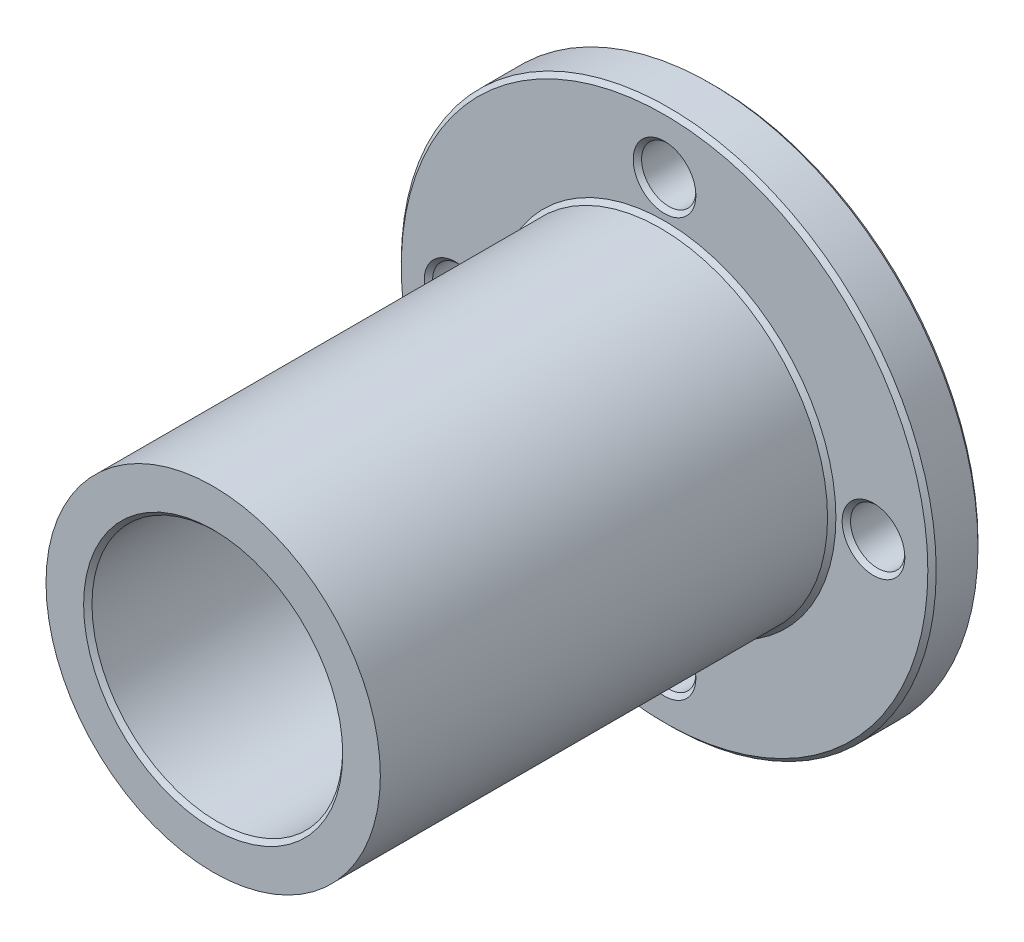
ISO-10303-21;
HEADER;
FILE_DESCRIPTION(('STEP AP214'),'2;1');
FILE_NAME('part.step','',(''),(''),'','','');
FILE_SCHEMA(('AUTOMOTIVE_DESIGN { 1 0 10303 214 1 1 1 1 }'));
ENDSEC;
DATA;
#1=APPLICATION_CONTEXT('core data for automotive mechanical design processes');
#2=APPLICATION_PROTOCOL_DEFINITION('international standard','automotive_design',2000,#1);
#3=PRODUCT_CONTEXT('',#1,'mechanical');
#4=PRODUCT('Part','Part','',(#3));
#5=PRODUCT_RELATED_PRODUCT_CATEGORY('part','',(#4));
#6=PRODUCT_DEFINITION_FORMATION('','',#4);
#7=PRODUCT_DEFINITION_CONTEXT('part definition',#1,'design');
#8=PRODUCT_DEFINITION('design','',#6,#7);
#9=PRODUCT_DEFINITION_SHAPE('','',#8);
#10=(LENGTH_UNIT() NAMED_UNIT(*) SI_UNIT(.MILLI.,.METRE.));
#11=(NAMED_UNIT(*) PLANE_ANGLE_UNIT() SI_UNIT($,.RADIAN.));
#12=(NAMED_UNIT(*) SI_UNIT($,.STERADIAN.) SOLID_ANGLE_UNIT());
#13=UNCERTAINTY_MEASURE_WITH_UNIT(LENGTH_MEASURE(1.E-05),#10,'distance_accuracy_value','');
#14=(GEOMETRIC_REPRESENTATION_CONTEXT(3) GLOBAL_UNCERTAINTY_ASSIGNED_CONTEXT((#13)) GLOBAL_UNIT_ASSIGNED_CONTEXT((#10,
#11,#12)) REPRESENTATION_CONTEXT('',''));
#15=CARTESIAN_POINT('',(0.,0.,0.));
#16=DIRECTION('',(0.,0.,1.));
#17=DIRECTION('',(1.,0.,0.));
#18=AXIS2_PLACEMENT_3D('',#15,#16,#17);
#19=CARTESIAN_POINT('',(0.,0.,6.));
#20=DIRECTION('',(0.,0.,1.));
#21=DIRECTION('',(1.,0.,0.));
#22=AXIS2_PLACEMENT_3D('',#19,#20,#21);
#23=PLANE('',#22);
#24=CARTESIAN_POINT('',(0.,0.,6.));
#25=DIRECTION('',(0.,0.,1.));
#26=DIRECTION('',(1.,0.,0.));
#27=AXIS2_PLACEMENT_3D('',#24,#25,#26);
#28=CIRCLE('',#27,20.5);
#29=CARTESIAN_POINT('',(20.5,0.,6.));
#30=VERTEX_POINT('',#29);
#31=EDGE_CURVE('E53',#30,#30,#28,.F.);
#32=ORIENTED_EDGE('',*,*,#31,.T.);
#33=EDGE_LOOP('',(#32));
#34=FACE_BOUND('',#33,.T.);
#35=CARTESIAN_POINT('',(0.,0.,6.));
#36=DIRECTION('',(0.,0.,1.));
#37=DIRECTION('',(1.,0.,0.));
#38=AXIS2_PLACEMENT_3D('',#35,#36,#37);
#39=CIRCLE('',#38,31.5);
#40=CARTESIAN_POINT('',(31.5,0.,6.));
#41=VERTEX_POINT('',#40);
#42=EDGE_CURVE('E58',#41,#41,#39,.T.);
#43=ORIENTED_EDGE('',*,*,#42,.T.);
#44=EDGE_LOOP('',(#43));
#45=FACE_BOUND('',#44,.T.);
#46=CARTESIAN_POINT('',(24.9999999999993,-7.09011927261166E-13,6.));
#47=DIRECTION('',(0.,0.,1.));
#48=DIRECTION('',(1.,0.,0.));
#49=AXIS2_PLACEMENT_3D('',#46,#47,#48);
#50=CIRCLE('',#49,3.75000000000114);
#51=CARTESIAN_POINT('',(28.7500000000004,-7.09011927261166E-13,6.));
#52=VERTEX_POINT('',#51);
#53=EDGE_CURVE('E64',#52,#52,#50,.F.);
#54=ORIENTED_EDGE('',*,*,#53,.T.);
#55=EDGE_LOOP('',(#54));
#56=FACE_BOUND('',#55,.T.);
#57=CARTESIAN_POINT('',(-1.4119006205266E-12,-25.,6.));
#58=DIRECTION('',(0.,0.,1.));
#59=DIRECTION('',(1.,0.,0.));
#60=AXIS2_PLACEMENT_3D('',#57,#58,#59);
#61=CIRCLE('',#60,3.75000000000153);
#62=CARTESIAN_POINT('',(3.75000000000012,-25.,6.));
#63=VERTEX_POINT('',#62);
#64=EDGE_CURVE('E68',#63,#63,#61,.F.);
#65=ORIENTED_EDGE('',*,*,#64,.T.);
#66=EDGE_LOOP('',(#65));
#67=FACE_BOUND('',#66,.T.);
#68=CARTESIAN_POINT('',(-25.0000000000007,7.05950310263298E-13,6.));
#69=DIRECTION('',(0.,0.,1.));
#70=DIRECTION('',(1.,0.,0.));
#71=AXIS2_PLACEMENT_3D('',#68,#69,#70);
#72=CIRCLE('',#71,3.75000000000055);
#73=CARTESIAN_POINT('',(-21.2500000000002,7.05950310263298E-13,6.));
#74=VERTEX_POINT('',#73);
#75=EDGE_CURVE('E72',#74,#74,#72,.F.);
#76=ORIENTED_EDGE('',*,*,#75,.T.);
#77=EDGE_LOOP('',(#76));
#78=FACE_BOUND('',#77,.T.);
#79=CARTESIAN_POINT('',(0.,25.,6.));
#80=DIRECTION('',(0.,0.,1.));
#81=DIRECTION('',(1.,0.,0.));
#82=AXIS2_PLACEMENT_3D('',#79,#80,#81);
#83=CIRCLE('',#82,3.75);
#84=CARTESIAN_POINT('',(3.75,25.,6.));
#85=VERTEX_POINT('',#84);
#86=EDGE_CURVE('E76',#85,#85,#83,.F.);
#87=ORIENTED_EDGE('',*,*,#86,.T.);
#88=EDGE_LOOP('',(#87));
#89=FACE_BOUND('',#88,.T.);
#90=ADVANCED_FACE('F39',(#34,#45,#56,#67,#78,#89),#23,.T.);
#91=CARTESIAN_POINT('',(0.,0.,0.));
#92=DIRECTION('',(0.,0.,1.));
#93=DIRECTION('',(1.,0.,0.));
#94=AXIS2_PLACEMENT_3D('',#91,#92,#93);
#95=PLANE('',#94);
#96=CARTESIAN_POINT('',(0.,0.,0.));
#97=DIRECTION('',(0.,0.,1.));
#98=DIRECTION('',(1.,0.,0.));
#99=AXIS2_PLACEMENT_3D('',#96,#97,#98);
#100=CIRCLE('',#99,31.5);
#101=CARTESIAN_POINT('',(31.5,0.,0.));
#102=VERTEX_POINT('',#101);
#103=EDGE_CURVE('E120',#102,#102,#100,.F.);
#104=ORIENTED_EDGE('',*,*,#103,.T.);
#105=EDGE_LOOP('',(#104));
#106=FACE_BOUND('',#105,.T.);
#107=CARTESIAN_POINT('',(0.,0.,0.));
#108=DIRECTION('',(0.,0.,1.));
#109=DIRECTION('',(1.,0.,0.));
#110=AXIS2_PLACEMENT_3D('',#107,#108,#109);
#111=CIRCLE('',#110,20.5);
#112=CARTESIAN_POINT('',(20.5,0.,0.));
#113=VERTEX_POINT('',#112);
#114=EDGE_CURVE('E124',#113,#113,#111,.T.);
#115=ORIENTED_EDGE('',*,*,#114,.T.);
#116=EDGE_LOOP('',(#115));
#117=FACE_BOUND('',#116,.T.);
#118=CARTESIAN_POINT('',(24.9999999999993,-7.09011927261166E-13,0.));
#119=DIRECTION('',(0.,0.,1.));
#120=DIRECTION('',(1.,0.,0.));
#121=AXIS2_PLACEMENT_3D('',#118,#119,#120);
#122=CIRCLE('',#121,3.75000000000114);
#123=CARTESIAN_POINT('',(28.7500000000004,-7.09011927261166E-13,0.));
#124=VERTEX_POINT('',#123);
#125=EDGE_CURVE('E128',#124,#124,#122,.T.);
#126=ORIENTED_EDGE('',*,*,#125,.T.);
#127=EDGE_LOOP('',(#126));
#128=FACE_BOUND('',#127,.T.);
#129=CARTESIAN_POINT('',(-1.4119006205266E-12,-25.,0.));
#130=DIRECTION('',(0.,0.,1.));
#131=DIRECTION('',(1.,0.,0.));
#132=AXIS2_PLACEMENT_3D('',#129,#130,#131);
#133=CIRCLE('',#132,3.75000000000153);
#134=CARTESIAN_POINT('',(3.75000000000012,-25.,0.));
#135=VERTEX_POINT('',#134);
#136=EDGE_CURVE('E132',#135,#135,#133,.T.);
#137=ORIENTED_EDGE('',*,*,#136,.T.);
#138=EDGE_LOOP('',(#137));
#139=FACE_BOUND('',#138,.T.);
#140=CARTESIAN_POINT('',(-25.0000000000007,7.05950310263298E-13,0.));
#141=DIRECTION('',(0.,0.,1.));
#142=DIRECTION('',(1.,0.,0.));
#143=AXIS2_PLACEMENT_3D('',#140,#141,#142);
#144=CIRCLE('',#143,3.75000000000056);
#145=CARTESIAN_POINT('',(-21.2500000000001,7.05950310263298E-13,0.));
#146=VERTEX_POINT('',#145);
#147=EDGE_CURVE('E136',#146,#146,#144,.T.);
#148=ORIENTED_EDGE('',*,*,#147,.T.);
#149=EDGE_LOOP('',(#148));
#150=FACE_BOUND('',#149,.T.);
#151=CARTESIAN_POINT('',(0.,25.,0.));
#152=DIRECTION('',(0.,0.,1.));
#153=DIRECTION('',(1.,0.,0.));
#154=AXIS2_PLACEMENT_3D('',#151,#152,#153);
#155=CIRCLE('',#154,3.75);
#156=CARTESIAN_POINT('',(3.75,25.,0.));
#157=VERTEX_POINT('',#156);
#158=EDGE_CURVE('E140',#157,#157,#155,.T.);
#159=ORIENTED_EDGE('',*,*,#158,.T.);
#160=EDGE_LOOP('',(#159));
#161=FACE_BOUND('',#160,.T.);
#162=ADVANCED_FACE('F183',(#106,#117,#128,#139,#150,#161),#95,.F.);
#163=CARTESIAN_POINT('',(0.,0.,6.));
#164=DIRECTION('',(0.,0.,-1.));
#165=DIRECTION('',(-1.,0.,0.));
#166=AXIS2_PLACEMENT_3D('',#163,#164,#165);
#167=CYLINDRICAL_SURFACE('',#166,32.);
#168=CARTESIAN_POINT('',(0.,0.,0.499999999999994));
#169=DIRECTION('',(0.,0.,1.));
#170=DIRECTION('',(1.,0.,0.));
#171=AXIS2_PLACEMENT_3D('',#168,#169,#170);
#172=CIRCLE('',#171,32.);
#173=CARTESIAN_POINT('',(32.,0.,0.499999999999994));
#174=VERTEX_POINT('',#173);
#175=EDGE_CURVE('E144',#174,#174,#172,.T.);
#176=ORIENTED_EDGE('',*,*,#175,.T.);
#177=EDGE_LOOP('',(#176));
#178=FACE_BOUND('',#177,.T.);
#179=CARTESIAN_POINT('',(0.,0.,5.50000000000001));
#180=DIRECTION('',(0.,0.,1.));
#181=DIRECTION('',(1.,0.,0.));
#182=AXIS2_PLACEMENT_3D('',#179,#180,#181);
#183=CIRCLE('',#182,32.);
#184=CARTESIAN_POINT('',(32.,0.,5.50000000000001));
#185=VERTEX_POINT('',#184);
#186=EDGE_CURVE('E148',#185,#185,#183,.F.);
#187=ORIENTED_EDGE('',*,*,#186,.T.);
#188=EDGE_LOOP('',(#187));
#189=FACE_BOUND('',#188,.T.);
#190=ADVANCED_FACE('F189',(#178,#189),#167,.T.);
#191=CARTESIAN_POINT('',(0.,0.,60.));
#192=DIRECTION('',(0.,0.,-1.));
#193=DIRECTION('',(-1.,0.,0.));
#194=AXIS2_PLACEMENT_3D('',#191,#192,#193);
#195=CYLINDRICAL_SURFACE('',#194,20.);
#196=CARTESIAN_POINT('',(0.,0.,6.50000000000001));
#197=DIRECTION('',(0.,0.,1.));
#198=DIRECTION('',(1.,0.,0.));
#199=AXIS2_PLACEMENT_3D('',#196,#197,#198);
#200=CIRCLE('',#199,20.);
#201=CARTESIAN_POINT('',(20.,0.,6.50000000000001));
#202=VERTEX_POINT('',#201);
#203=EDGE_CURVE('E80',#202,#202,#200,.T.);
#204=ORIENTED_EDGE('',*,*,#203,.T.);
#205=EDGE_LOOP('',(#204));
#206=FACE_BOUND('',#205,.T.);
#207=CARTESIAN_POINT('',(0.,0.,60.));
#208=DIRECTION('',(0.,0.,1.));
#209=DIRECTION('',(1.,0.,0.));
#210=AXIS2_PLACEMENT_3D('',#207,#208,#209);
#211=CIRCLE('',#210,20.);
#212=CARTESIAN_POINT('',(20.,0.,60.));
#213=VERTEX_POINT('',#212);
#214=EDGE_CURVE('E152',#213,#213,#211,.T.);
#215=ORIENTED_EDGE('',*,*,#214,.F.);
#216=EDGE_LOOP('',(#215));
#217=FACE_BOUND('',#216,.T.);
#218=ADVANCED_FACE('F194',(#206,#217),#195,.T.);
#219=CARTESIAN_POINT('',(0.,0.,60.));
#220=DIRECTION('',(0.,0.,1.));
#221=DIRECTION('',(1.,0.,0.));
#222=AXIS2_PLACEMENT_3D('',#219,#220,#221);
#223=PLANE('',#222);
#224=CARTESIAN_POINT('',(0.,0.,60.));
#225=DIRECTION('',(0.,0.,1.));
#226=DIRECTION('',(1.,0.,0.));
#227=AXIS2_PLACEMENT_3D('',#224,#225,#226);
#228=CIRCLE('',#227,15.5);
#229=CARTESIAN_POINT('',(15.5,0.,60.));
#230=VERTEX_POINT('',#229);
#231=EDGE_CURVE('E48',#230,#230,#228,.F.);
#232=ORIENTED_EDGE('',*,*,#231,.T.);
#233=EDGE_LOOP('',(#232));
#234=FACE_BOUND('',#233,.T.);
#235=ORIENTED_EDGE('',*,*,#214,.T.);
#236=EDGE_LOOP('',(#235));
#237=FACE_BOUND('',#236,.T.);
#238=ADVANCED_FACE('F427',(#234,#237),#223,.T.);
#239=CARTESIAN_POINT('',(0.,0.,0.));
#240=DIRECTION('',(0.,0.,-1.));
#241=DIRECTION('',(-1.,0.,0.));
#242=AXIS2_PLACEMENT_3D('',#239,#240,#241);
#243=CYLINDRICAL_SURFACE('',#242,15.);
#244=CARTESIAN_POINT('',(0.,0.,59.5));
#245=DIRECTION('',(0.,0.,1.));
#246=DIRECTION('',(1.,0.,0.));
#247=AXIS2_PLACEMENT_3D('',#244,#245,#246);
#248=CIRCLE('',#247,15.);
#249=CARTESIAN_POINT('',(15.,0.,59.5));
#250=VERTEX_POINT('',#249);
#251=EDGE_CURVE('E10',#250,#250,#248,.T.);
#252=ORIENTED_EDGE('',*,*,#251,.T.);
#253=EDGE_LOOP('',(#252));
#254=FACE_BOUND('',#253,.T.);
#255=CARTESIAN_POINT('',(0.,0.,2.3));
#256=DIRECTION('',(0.,0.,-1.));
#257=DIRECTION('',(-1.,0.,0.));
#258=AXIS2_PLACEMENT_3D('',#255,#256,#257);
#259=CIRCLE('',#258,15.);
#260=CARTESIAN_POINT('',(-15.,0.,2.3));
#261=VERTEX_POINT('',#260);
#262=EDGE_CURVE('E156',#261,#261,#259,.T.);
#263=ORIENTED_EDGE('',*,*,#262,.T.);
#264=EDGE_LOOP('',(#263));
#265=FACE_BOUND('',#264,.T.);
#266=ADVANCED_FACE('F179',(#254,#265),#243,.F.);
#267=CARTESIAN_POINT('',(15.,0.,2.3));
#268=DIRECTION('',(0.,0.,1.));
#269=DIRECTION('',(1.,0.,0.));
#270=AXIS2_PLACEMENT_3D('',#267,#268,#269);
#271=PLANE('',#270);
#272=ORIENTED_EDGE('',*,*,#262,.F.);
#273=EDGE_LOOP('',(#272));
#274=FACE_BOUND('',#273,.T.);
#275=CARTESIAN_POINT('',(0.,0.,2.3));
#276=DIRECTION('',(0.,0.,-1.));
#277=DIRECTION('',(-1.,0.,0.));
#278=AXIS2_PLACEMENT_3D('',#275,#276,#277);
#279=CIRCLE('',#278,20.);
#280=CARTESIAN_POINT('',(-20.,0.,2.3));
#281=VERTEX_POINT('',#280);
#282=EDGE_CURVE('E160',#281,#281,#279,.T.);
#283=ORIENTED_EDGE('',*,*,#282,.T.);
#284=EDGE_LOOP('',(#283));
#285=FACE_BOUND('',#284,.T.);
#286=ADVANCED_FACE('F165',(#274,#285),#271,.F.);
#287=CARTESIAN_POINT('',(0.,0.,0.));
#288=DIRECTION('',(0.,0.,-1.));
#289=DIRECTION('',(-1.,0.,0.));
#290=AXIS2_PLACEMENT_3D('',#287,#288,#289);
#291=CYLINDRICAL_SURFACE('',#290,20.);
#292=CARTESIAN_POINT('',(0.,0.,0.499999999999983));
#293=DIRECTION('',(0.,0.,1.));
#294=DIRECTION('',(1.,0.,0.));
#295=AXIS2_PLACEMENT_3D('',#292,#293,#294);
#296=CIRCLE('',#295,20.);
#297=CARTESIAN_POINT('',(20.,0.,0.499999999999983));
#298=VERTEX_POINT('',#297);
#299=EDGE_CURVE('E116',#298,#298,#296,.F.);
#300=ORIENTED_EDGE('',*,*,#299,.T.);
#301=EDGE_LOOP('',(#300));
#302=FACE_BOUND('',#301,.T.);
#303=ORIENTED_EDGE('',*,*,#282,.F.);
#304=EDGE_LOOP('',(#303));
#305=FACE_BOUND('',#304,.T.);
#306=ADVANCED_FACE('F167',(#302,#305),#291,.F.);
#307=CARTESIAN_POINT('',(24.9999999999993,-7.09011927261166E-13,6.));
#308=DIRECTION('',(0.,0.,-1.));
#309=DIRECTION('',(-1.,0.,0.));
#310=AXIS2_PLACEMENT_3D('',#307,#308,#309);
#311=CYLINDRICAL_SURFACE('',#310,3.25000000000113);
#312=CARTESIAN_POINT('',(24.9999999999993,-7.09011927261166E-13,0.500000000000006));
#313=DIRECTION('',(0.,0.,1.));
#314=DIRECTION('',(1.,0.,0.));
#315=AXIS2_PLACEMENT_3D('',#312,#313,#314);
#316=CIRCLE('',#315,3.25000000000113);
#317=CARTESIAN_POINT('',(28.2500000000004,-7.09011927261166E-13,0.500000000000006));
#318=VERTEX_POINT('',#317);
#319=EDGE_CURVE('E108',#318,#318,#316,.F.);
#320=ORIENTED_EDGE('',*,*,#319,.T.);
#321=EDGE_LOOP('',(#320));
#322=FACE_BOUND('',#321,.T.);
#323=CARTESIAN_POINT('',(24.9999999999993,-7.09011927261166E-13,5.5));
#324=DIRECTION('',(0.,0.,1.));
#325=DIRECTION('',(1.,0.,0.));
#326=AXIS2_PLACEMENT_3D('',#323,#324,#325);
#327=CIRCLE('',#326,3.25000000000113);
#328=CARTESIAN_POINT('',(28.2500000000004,-7.09011927261166E-13,5.5));
#329=VERTEX_POINT('',#328);
#330=EDGE_CURVE('E112',#329,#329,#327,.T.);
#331=ORIENTED_EDGE('',*,*,#330,.T.);
#332=EDGE_LOOP('',(#331));
#333=FACE_BOUND('',#332,.T.);
#334=ADVANCED_FACE('F169',(#322,#333),#311,.F.);
#335=CARTESIAN_POINT('',(-1.4119006205266E-12,-25.,6.));
#336=DIRECTION('',(0.,0.,-1.));
#337=DIRECTION('',(-1.,0.,0.));
#338=AXIS2_PLACEMENT_3D('',#335,#336,#337);
#339=CYLINDRICAL_SURFACE('',#338,3.25000000000152);
#340=CARTESIAN_POINT('',(-1.4119006205266E-12,-25.,0.50000000000001));
#341=DIRECTION('',(0.,0.,1.));
#342=DIRECTION('',(1.,0.,0.));
#343=AXIS2_PLACEMENT_3D('',#340,#341,#342);
#344=CIRCLE('',#343,3.25000000000152);
#345=CARTESIAN_POINT('',(3.25000000000011,-25.,0.50000000000001));
#346=VERTEX_POINT('',#345);
#347=EDGE_CURVE('E100',#346,#346,#344,.F.);
#348=ORIENTED_EDGE('',*,*,#347,.T.);
#349=EDGE_LOOP('',(#348));
#350=FACE_BOUND('',#349,.T.);
#351=CARTESIAN_POINT('',(-1.4119006205266E-12,-25.,5.49999999999998));
#352=DIRECTION('',(0.,0.,1.));
#353=DIRECTION('',(1.,0.,0.));
#354=AXIS2_PLACEMENT_3D('',#351,#352,#353);
#355=CIRCLE('',#354,3.25000000000152);
#356=CARTESIAN_POINT('',(3.25000000000011,-25.,5.49999999999998));
#357=VERTEX_POINT('',#356);
#358=EDGE_CURVE('E104',#357,#357,#355,.T.);
#359=ORIENTED_EDGE('',*,*,#358,.T.);
#360=EDGE_LOOP('',(#359));
#361=FACE_BOUND('',#360,.T.);
#362=ADVANCED_FACE('F176',(#350,#361),#339,.F.);
#363=CARTESIAN_POINT('',(-25.0000000000007,7.05950310263298E-13,6.));
#364=DIRECTION('',(0.,0.,-1.));
#365=DIRECTION('',(-1.,0.,0.));
#366=AXIS2_PLACEMENT_3D('',#363,#364,#365);
#367=CYLINDRICAL_SURFACE('',#366,3.25000000000055);
#368=CARTESIAN_POINT('',(-25.0000000000007,7.05950310263298E-13,0.500000000000002));
#369=DIRECTION('',(0.,0.,1.));
#370=DIRECTION('',(1.,0.,0.));
#371=AXIS2_PLACEMENT_3D('',#368,#369,#370);
#372=CIRCLE('',#371,3.25000000000055);
#373=CARTESIAN_POINT('',(-21.7500000000002,7.05950310263298E-13,0.500000000000002));
#374=VERTEX_POINT('',#373);
#375=EDGE_CURVE('E92',#374,#374,#372,.F.);
#376=ORIENTED_EDGE('',*,*,#375,.T.);
#377=EDGE_LOOP('',(#376));
#378=FACE_BOUND('',#377,.T.);
#379=CARTESIAN_POINT('',(-25.0000000000007,7.05950310263298E-13,5.5));
#380=DIRECTION('',(0.,0.,1.));
#381=DIRECTION('',(1.,0.,0.));
#382=AXIS2_PLACEMENT_3D('',#379,#380,#381);
#383=CIRCLE('',#382,3.25000000000055);
#384=CARTESIAN_POINT('',(-21.7500000000002,7.05950310263298E-13,5.5));
#385=VERTEX_POINT('',#384);
#386=EDGE_CURVE('E96',#385,#385,#383,.T.);
#387=ORIENTED_EDGE('',*,*,#386,.T.);
#388=EDGE_LOOP('',(#387));
#389=FACE_BOUND('',#388,.T.);
#390=ADVANCED_FACE('F293',(#378,#389),#367,.F.);
#391=CARTESIAN_POINT('',(0.,25.,6.));
#392=DIRECTION('',(0.,0.,-1.));
#393=DIRECTION('',(-1.,0.,0.));
#394=AXIS2_PLACEMENT_3D('',#391,#392,#393);
#395=CYLINDRICAL_SURFACE('',#394,3.25);
#396=CARTESIAN_POINT('',(0.,25.,0.500000000000001));
#397=DIRECTION('',(0.,0.,1.));
#398=DIRECTION('',(1.,0.,0.));
#399=AXIS2_PLACEMENT_3D('',#396,#397,#398);
#400=CIRCLE('',#399,3.25);
#401=CARTESIAN_POINT('',(3.25,25.,0.500000000000001));
#402=VERTEX_POINT('',#401);
#403=EDGE_CURVE('E84',#402,#402,#400,.F.);
#404=ORIENTED_EDGE('',*,*,#403,.T.);
#405=EDGE_LOOP('',(#404));
#406=FACE_BOUND('',#405,.T.);
#407=CARTESIAN_POINT('',(0.,25.,5.49999999999999));
#408=DIRECTION('',(0.,0.,1.));
#409=DIRECTION('',(1.,0.,0.));
#410=AXIS2_PLACEMENT_3D('',#407,#408,#409);
#411=CIRCLE('',#410,3.25);
#412=CARTESIAN_POINT('',(3.25,25.,5.49999999999999));
#413=VERTEX_POINT('',#412);
#414=EDGE_CURVE('E88',#413,#413,#411,.T.);
#415=ORIENTED_EDGE('',*,*,#414,.T.);
#416=EDGE_LOOP('',(#415));
#417=FACE_BOUND('',#416,.T.);
#418=ADVANCED_FACE('F208',(#406,#417),#395,.F.);
#419=CARTESIAN_POINT('',(0.,0.,0.499999999999994));
#420=DIRECTION('',(0.,0.,1.));
#421=DIRECTION('',(1.,0.,0.));
#422=AXIS2_PLACEMENT_3D('',#419,#420,#421);
#423=CONICAL_SURFACE('',#422,32.,0.785398163397448);
#424=ORIENTED_EDGE('',*,*,#103,.F.);
#425=EDGE_LOOP('',(#424));
#426=FACE_BOUND('',#425,.T.);
#427=ORIENTED_EDGE('',*,*,#175,.F.);
#428=EDGE_LOOP('',(#427));
#429=FACE_BOUND('',#428,.T.);
#430=ADVANCED_FACE('F201',(#426,#429),#423,.T.);
#431=CARTESIAN_POINT('',(0.,0.,0.499999999999983));
#432=DIRECTION('',(0.,0.,-1.));
#433=DIRECTION('',(-1.,0.,0.));
#434=AXIS2_PLACEMENT_3D('',#431,#432,#433);
#435=CONICAL_SURFACE('',#434,20.,0.785398163397448);
#436=ORIENTED_EDGE('',*,*,#114,.F.);
#437=EDGE_LOOP('',(#436));
#438=FACE_BOUND('',#437,.T.);
#439=ORIENTED_EDGE('',*,*,#299,.F.);
#440=EDGE_LOOP('',(#439));
#441=FACE_BOUND('',#440,.T.);
#442=ADVANCED_FACE('F207',(#438,#441),#435,.F.);
#443=CARTESIAN_POINT('',(24.9999999999993,-7.09011927261166E-13,0.500000000000006));
#444=DIRECTION('',(0.,0.,-1.));
#445=DIRECTION('',(-1.,0.,0.));
#446=AXIS2_PLACEMENT_3D('',#443,#444,#445);
#447=CONICAL_SURFACE('',#446,3.25000000000113,0.78539816339745);
#448=ORIENTED_EDGE('',*,*,#125,.F.);
#449=EDGE_LOOP('',(#448));
#450=FACE_BOUND('',#449,.T.);
#451=ORIENTED_EDGE('',*,*,#319,.F.);
#452=EDGE_LOOP('',(#451));
#453=FACE_BOUND('',#452,.T.);
#454=ADVANCED_FACE('F215',(#450,#453),#447,.F.);
#455=CARTESIAN_POINT('',(-1.4119006205266E-12,-25.,0.50000000000001));
#456=DIRECTION('',(0.,0.,-1.));
#457=DIRECTION('',(-1.,0.,0.));
#458=AXIS2_PLACEMENT_3D('',#455,#456,#457);
#459=CONICAL_SURFACE('',#458,3.25000000000152,0.785398163397451);
#460=ORIENTED_EDGE('',*,*,#136,.F.);
#461=EDGE_LOOP('',(#460));
#462=FACE_BOUND('',#461,.T.);
#463=ORIENTED_EDGE('',*,*,#347,.F.);
#464=EDGE_LOOP('',(#463));
#465=FACE_BOUND('',#464,.T.);
#466=ADVANCED_FACE('F222',(#462,#465),#459,.F.);
#467=CARTESIAN_POINT('',(-25.0000000000007,7.05950310263298E-13,0.500000000000002));
#468=DIRECTION('',(0.,0.,-1.));
#469=DIRECTION('',(-1.,0.,0.));
#470=AXIS2_PLACEMENT_3D('',#467,#468,#469);
#471=CONICAL_SURFACE('',#470,3.25000000000055,0.785398163397448);
#472=ORIENTED_EDGE('',*,*,#147,.F.);
#473=EDGE_LOOP('',(#472));
#474=FACE_BOUND('',#473,.T.);
#475=ORIENTED_EDGE('',*,*,#375,.F.);
#476=EDGE_LOOP('',(#475));
#477=FACE_BOUND('',#476,.T.);
#478=ADVANCED_FACE('F229',(#474,#477),#471,.F.);
#479=CARTESIAN_POINT('',(0.,25.,0.500000000000001));
#480=DIRECTION('',(0.,0.,-1.));
#481=DIRECTION('',(-1.,0.,0.));
#482=AXIS2_PLACEMENT_3D('',#479,#480,#481);
#483=CONICAL_SURFACE('',#482,3.25,0.78539816339745);
#484=ORIENTED_EDGE('',*,*,#158,.F.);
#485=EDGE_LOOP('',(#484));
#486=FACE_BOUND('',#485,.T.);
#487=ORIENTED_EDGE('',*,*,#403,.F.);
#488=EDGE_LOOP('',(#487));
#489=FACE_BOUND('',#488,.T.);
#490=ADVANCED_FACE('F236',(#486,#489),#483,.F.);
#491=CARTESIAN_POINT('',(0.,0.,6.50000000000001));
#492=DIRECTION('',(0.,0.,-1.));
#493=DIRECTION('',(-1.,0.,0.));
#494=AXIS2_PLACEMENT_3D('',#491,#492,#493);
#495=CONICAL_SURFACE('',#494,20.,0.785398163397431);
#496=ORIENTED_EDGE('',*,*,#31,.F.);
#497=EDGE_LOOP('',(#496));
#498=FACE_BOUND('',#497,.T.);
#499=ORIENTED_EDGE('',*,*,#203,.F.);
#500=EDGE_LOOP('',(#499));
#501=FACE_BOUND('',#500,.T.);
#502=ADVANCED_FACE('F243',(#498,#501),#495,.T.);
#503=CARTESIAN_POINT('',(0.,0.,6.));
#504=DIRECTION('',(0.,0.,-1.));
#505=DIRECTION('',(-1.,0.,0.));
#506=AXIS2_PLACEMENT_3D('',#503,#504,#505);
#507=CONICAL_SURFACE('',#506,31.5,0.785398163397448);
#508=ORIENTED_EDGE('',*,*,#186,.F.);
#509=EDGE_LOOP('',(#508));
#510=FACE_BOUND('',#509,.T.);
#511=ORIENTED_EDGE('',*,*,#42,.F.);
#512=EDGE_LOOP('',(#511));
#513=FACE_BOUND('',#512,.T.);
#514=ADVANCED_FACE('F250',(#510,#513),#507,.T.);
#515=CARTESIAN_POINT('',(24.9999999999993,-7.09011927261166E-13,6.));
#516=DIRECTION('',(0.,0.,1.));
#517=DIRECTION('',(1.,0.,0.));
#518=AXIS2_PLACEMENT_3D('',#515,#516,#517);
#519=CONICAL_SURFACE('',#518,3.75000000000114,0.785398163397455);
#520=ORIENTED_EDGE('',*,*,#330,.F.);
#521=EDGE_LOOP('',(#520));
#522=FACE_BOUND('',#521,.T.);
#523=ORIENTED_EDGE('',*,*,#53,.F.);
#524=EDGE_LOOP('',(#523));
#525=FACE_BOUND('',#524,.T.);
#526=ADVANCED_FACE('F257',(#522,#525),#519,.F.);
#527=CARTESIAN_POINT('',(-1.4119006205266E-12,-25.,6.));
#528=DIRECTION('',(0.,0.,1.));
#529=DIRECTION('',(1.,0.,0.));
#530=AXIS2_PLACEMENT_3D('',#527,#528,#529);
#531=CONICAL_SURFACE('',#530,3.75000000000153,0.785398163397445);
#532=ORIENTED_EDGE('',*,*,#358,.F.);
#533=EDGE_LOOP('',(#532));
#534=FACE_BOUND('',#533,.T.);
#535=ORIENTED_EDGE('',*,*,#64,.F.);
#536=EDGE_LOOP('',(#535));
#537=FACE_BOUND('',#536,.T.);
#538=ADVANCED_FACE('F264',(#534,#537),#531,.F.);
#539=CARTESIAN_POINT('',(-25.0000000000007,7.05950310263298E-13,6.));
#540=DIRECTION('',(0.,0.,1.));
#541=DIRECTION('',(1.,0.,0.));
#542=AXIS2_PLACEMENT_3D('',#539,#540,#541);
#543=CONICAL_SURFACE('',#542,3.75000000000055,0.785398163397443);
#544=ORIENTED_EDGE('',*,*,#386,.F.);
#545=EDGE_LOOP('',(#544));
#546=FACE_BOUND('',#545,.T.);
#547=ORIENTED_EDGE('',*,*,#75,.F.);
#548=EDGE_LOOP('',(#547));
#549=FACE_BOUND('',#548,.T.);
#550=ADVANCED_FACE('F271',(#546,#549),#543,.F.);
#551=CARTESIAN_POINT('',(0.,25.,6.));
#552=DIRECTION('',(0.,0.,1.));
#553=DIRECTION('',(1.,0.,0.));
#554=AXIS2_PLACEMENT_3D('',#551,#552,#553);
#555=CONICAL_SURFACE('',#554,3.75,0.785398163397446);
#556=ORIENTED_EDGE('',*,*,#414,.F.);
#557=EDGE_LOOP('',(#556));
#558=FACE_BOUND('',#557,.T.);
#559=ORIENTED_EDGE('',*,*,#86,.F.);
#560=EDGE_LOOP('',(#559));
#561=FACE_BOUND('',#560,.T.);
#562=ADVANCED_FACE('F277',(#558,#561),#555,.F.);
#563=CARTESIAN_POINT('',(0.,0.,60.));
#564=DIRECTION('',(0.,0.,1.));
#565=DIRECTION('',(1.,0.,0.));
#566=AXIS2_PLACEMENT_3D('',#563,#564,#565);
#567=CONICAL_SURFACE('',#566,15.5,0.785398163397452);
#568=ORIENTED_EDGE('',*,*,#251,.F.);
#569=EDGE_LOOP('',(#568));
#570=FACE_BOUND('',#569,.T.);
#571=ORIENTED_EDGE('',*,*,#231,.F.);
#572=EDGE_LOOP('',(#571));
#573=FACE_BOUND('',#572,.T.);
#574=ADVANCED_FACE('F42',(#570,#573),#567,.F.);
#575=CLOSED_SHELL('',(#90,#162,#190,#218,#238,#266,#286,#306,#334,#362,#390,#418,#430,#442,#454,
#466,#478,#490,#502,#514,#526,#538,#550,#562,#574));
#576=MANIFOLD_SOLID_BREP('B2',#575);
#577=ADVANCED_BREP_SHAPE_REPRESENTATION('',(#18,#576),#14);
#578=SHAPE_DEFINITION_REPRESENTATION(#9,#577);
ENDSEC;
END-ISO-10303-21;
